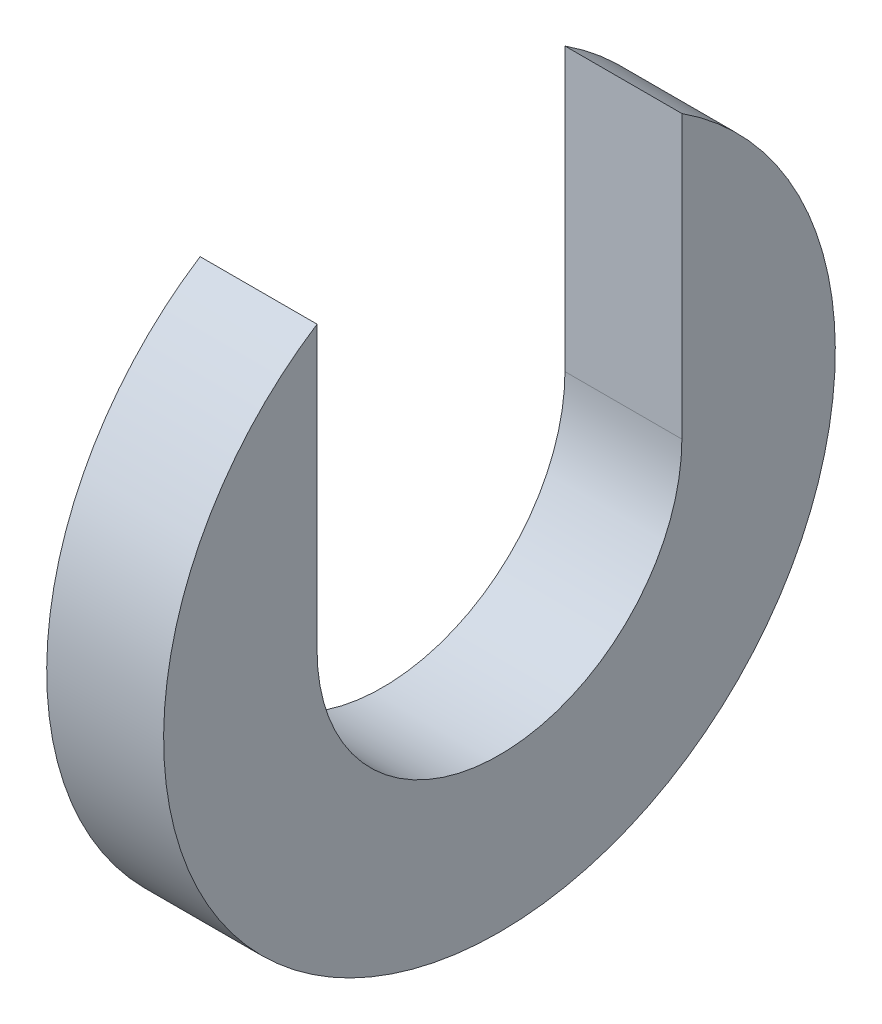
ISO-10303-21;
HEADER;
FILE_DESCRIPTION(('STEP AP214'),'2;1');
FILE_NAME('part.step','',(''),(''),'','','');
FILE_SCHEMA(('AUTOMOTIVE_DESIGN { 1 0 10303 214 1 1 1 1 }'));
ENDSEC;
DATA;
#1=APPLICATION_CONTEXT('core data for automotive mechanical design processes');
#2=APPLICATION_PROTOCOL_DEFINITION('international standard','automotive_design',2000,#1);
#3=PRODUCT_CONTEXT('',#1,'mechanical');
#4=PRODUCT('Part','Part','',(#3));
#5=PRODUCT_RELATED_PRODUCT_CATEGORY('part','',(#4));
#6=PRODUCT_DEFINITION_FORMATION('','',#4);
#7=PRODUCT_DEFINITION_CONTEXT('part definition',#1,'design');
#8=PRODUCT_DEFINITION('design','',#6,#7);
#9=PRODUCT_DEFINITION_SHAPE('','',#8);
#10=(LENGTH_UNIT() NAMED_UNIT(*) SI_UNIT(.MILLI.,.METRE.));
#11=(NAMED_UNIT(*) PLANE_ANGLE_UNIT() SI_UNIT($,.RADIAN.));
#12=(NAMED_UNIT(*) SI_UNIT($,.STERADIAN.) SOLID_ANGLE_UNIT());
#13=UNCERTAINTY_MEASURE_WITH_UNIT(LENGTH_MEASURE(1.E-05),#10,'distance_accuracy_value','');
#14=(GEOMETRIC_REPRESENTATION_CONTEXT(3) GLOBAL_UNCERTAINTY_ASSIGNED_CONTEXT((#13)) GLOBAL_UNIT_ASSIGNED_CONTEXT((#10,
#11,#12)) REPRESENTATION_CONTEXT('',''));
#15=CARTESIAN_POINT('',(0.,0.,0.));
#16=DIRECTION('',(0.,0.,1.));
#17=DIRECTION('',(1.,0.,0.));
#18=AXIS2_PLACEMENT_3D('',#15,#16,#17);
#19=CARTESIAN_POINT('',(3.175,0.,0.));
#20=DIRECTION('',(-1.,0.,0.));
#21=DIRECTION('',(0.,0.,1.));
#22=AXIS2_PLACEMENT_3D('',#19,#20,#21);
#23=CYLINDRICAL_SURFACE('',#22,4.953);
#24=CARTESIAN_POINT('',(0.,0.,0.));
#25=DIRECTION('',(-1.,0.,0.));
#26=DIRECTION('',(0.,0.,-1.));
#27=AXIS2_PLACEMENT_3D('',#24,#25,#26);
#28=CIRCLE('',#27,4.953);
#29=CARTESIAN_POINT('',(0.,0.,-4.953));
#30=VERTEX_POINT('',#29);
#31=CARTESIAN_POINT('',(0.,0.,4.953));
#32=VERTEX_POINT('',#31);
#33=EDGE_CURVE('E107',#30,#32,#28,.T.);
#34=ORIENTED_EDGE('',*,*,#33,.T.);
#35=DIRECTION('',(-1.,0.,0.));
#36=VECTOR('',#35,1.);
#37=CARTESIAN_POINT('',(3.175,0.,4.953));
#38=LINE('',#37,#36);
#39=CARTESIAN_POINT('',(3.175,0.,4.953));
#40=VERTEX_POINT('',#39);
#41=EDGE_CURVE('E11',#40,#32,#38,.T.);
#42=ORIENTED_EDGE('',*,*,#41,.F.);
#43=CARTESIAN_POINT('',(3.175,0.,0.));
#44=DIRECTION('',(-1.,0.,0.));
#45=DIRECTION('',(0.,0.,-1.));
#46=AXIS2_PLACEMENT_3D('',#43,#44,#45);
#47=CIRCLE('',#46,4.953);
#48=CARTESIAN_POINT('',(3.175,0.,-4.953));
#49=VERTEX_POINT('',#48);
#50=EDGE_CURVE('E91',#49,#40,#47,.T.);
#51=ORIENTED_EDGE('',*,*,#50,.F.);
#52=DIRECTION('',(-1.,0.,0.));
#53=VECTOR('',#52,1.);
#54=CARTESIAN_POINT('',(3.175,0.,-4.953));
#55=LINE('',#54,#53);
#56=EDGE_CURVE('E103',#49,#30,#55,.T.);
#57=ORIENTED_EDGE('',*,*,#56,.T.);
#58=EDGE_LOOP('',(#34,#42,#51,#57));
#59=FACE_BOUND('',#58,.T.);
#60=ADVANCED_FACE('F39',(#59),#23,.F.);
#61=CARTESIAN_POINT('',(3.175,0.,4.953));
#62=DIRECTION('',(0.,0.,1.));
#63=DIRECTION('',(1.,0.,0.));
#64=AXIS2_PLACEMENT_3D('',#61,#62,#63);
#65=PLANE('',#64);
#66=DIRECTION('',(0.,1.,0.));
#67=VECTOR('',#66,1.);
#68=CARTESIAN_POINT('',(0.,0.,4.953));
#69=LINE('',#68,#67);
#70=CARTESIAN_POINT('',(0.,7.65615157634696,4.953));
#71=VERTEX_POINT('',#70);
#72=EDGE_CURVE('E96',#32,#71,#69,.T.);
#73=ORIENTED_EDGE('',*,*,#72,.T.);
#74=DIRECTION('',(-1.,0.,0.));
#75=VECTOR('',#74,1.);
#76=CARTESIAN_POINT('',(3.175,7.65615157634696,4.953));
#77=LINE('',#76,#75);
#78=CARTESIAN_POINT('',(3.175,7.65615157634696,4.953));
#79=VERTEX_POINT('',#78);
#80=EDGE_CURVE('E48',#79,#71,#77,.T.);
#81=ORIENTED_EDGE('',*,*,#80,.F.);
#82=DIRECTION('',(0.,1.,0.));
#83=VECTOR('',#82,1.);
#84=CARTESIAN_POINT('',(3.175,0.,4.953));
#85=LINE('',#84,#83);
#86=EDGE_CURVE('E86',#40,#79,#85,.T.);
#87=ORIENTED_EDGE('',*,*,#86,.F.);
#88=ORIENTED_EDGE('',*,*,#41,.T.);
#89=EDGE_LOOP('',(#73,#81,#87,#88));
#90=FACE_BOUND('',#89,.T.);
#91=ADVANCED_FACE('F95',(#90),#65,.F.);
#92=CARTESIAN_POINT('',(3.175,0.,0.));
#93=DIRECTION('',(-1.,0.,0.));
#94=DIRECTION('',(0.,0.,1.));
#95=AXIS2_PLACEMENT_3D('',#92,#93,#94);
#96=CYLINDRICAL_SURFACE('',#95,9.1186);
#97=CARTESIAN_POINT('',(0.,0.,0.));
#98=DIRECTION('',(1.,0.,0.));
#99=DIRECTION('',(0.,0.,-1.));
#100=AXIS2_PLACEMENT_3D('',#97,#98,#99);
#101=CIRCLE('',#100,9.1186);
#102=CARTESIAN_POINT('',(0.,7.65615157634696,-4.953));
#103=VERTEX_POINT('',#102);
#104=EDGE_CURVE('E73',#71,#103,#101,.T.);
#105=ORIENTED_EDGE('',*,*,#104,.T.);
#106=DIRECTION('',(-1.,0.,0.));
#107=VECTOR('',#106,1.);
#108=CARTESIAN_POINT('',(3.175,7.65615157634696,-4.953));
#109=LINE('',#108,#107);
#110=CARTESIAN_POINT('',(3.175,7.65615157634696,-4.953));
#111=VERTEX_POINT('',#110);
#112=EDGE_CURVE('E98',#111,#103,#109,.T.);
#113=ORIENTED_EDGE('',*,*,#112,.F.);
#114=CARTESIAN_POINT('',(3.175,0.,0.));
#115=DIRECTION('',(1.,0.,0.));
#116=DIRECTION('',(0.,0.,-1.));
#117=AXIS2_PLACEMENT_3D('',#114,#115,#116);
#118=CIRCLE('',#117,9.1186);
#119=EDGE_CURVE('E89',#79,#111,#118,.T.);
#120=ORIENTED_EDGE('',*,*,#119,.F.);
#121=ORIENTED_EDGE('',*,*,#80,.T.);
#122=EDGE_LOOP('',(#105,#113,#120,#121));
#123=FACE_BOUND('',#122,.T.);
#124=ADVANCED_FACE('F99',(#123),#96,.T.);
#125=CARTESIAN_POINT('',(3.175,0.,-4.953));
#126=DIRECTION('',(0.,0.,-1.));
#127=DIRECTION('',(-1.,0.,0.));
#128=AXIS2_PLACEMENT_3D('',#125,#126,#127);
#129=PLANE('',#128);
#130=DIRECTION('',(0.,-1.,0.));
#131=VECTOR('',#130,1.);
#132=CARTESIAN_POINT('',(0.,0.,-4.953));
#133=LINE('',#132,#131);
#134=EDGE_CURVE('E79',#103,#30,#133,.T.);
#135=ORIENTED_EDGE('',*,*,#134,.T.);
#136=ORIENTED_EDGE('',*,*,#56,.F.);
#137=DIRECTION('',(0.,-1.,0.));
#138=VECTOR('',#137,1.);
#139=CARTESIAN_POINT('',(3.175,0.,-4.953));
#140=LINE('',#139,#138);
#141=EDGE_CURVE('E56',#111,#49,#140,.T.);
#142=ORIENTED_EDGE('',*,*,#141,.F.);
#143=ORIENTED_EDGE('',*,*,#112,.T.);
#144=EDGE_LOOP('',(#135,#136,#142,#143));
#145=FACE_BOUND('',#144,.T.);
#146=ADVANCED_FACE('F120',(#145),#129,.F.);
#147=CARTESIAN_POINT('',(3.175,0.,0.));
#148=DIRECTION('',(1.,0.,0.));
#149=DIRECTION('',(0.,0.,-1.));
#150=AXIS2_PLACEMENT_3D('',#147,#148,#149);
#151=PLANE('',#150);
#152=ORIENTED_EDGE('',*,*,#50,.T.);
#153=ORIENTED_EDGE('',*,*,#86,.T.);
#154=ORIENTED_EDGE('',*,*,#119,.T.);
#155=ORIENTED_EDGE('',*,*,#141,.T.);
#156=EDGE_LOOP('',(#152,#153,#154,#155));
#157=FACE_BOUND('',#156,.T.);
#158=ADVANCED_FACE('F87',(#157),#151,.T.);
#159=CARTESIAN_POINT('',(0.,0.,0.));
#160=DIRECTION('',(1.,0.,0.));
#161=DIRECTION('',(0.,0.,-1.));
#162=AXIS2_PLACEMENT_3D('',#159,#160,#161);
#163=PLANE('',#162);
#164=ORIENTED_EDGE('',*,*,#33,.F.);
#165=ORIENTED_EDGE('',*,*,#134,.F.);
#166=ORIENTED_EDGE('',*,*,#104,.F.);
#167=ORIENTED_EDGE('',*,*,#72,.F.);
#168=EDGE_LOOP('',(#164,#165,#166,#167));
#169=FACE_BOUND('',#168,.T.);
#170=ADVANCED_FACE('F123',(#169),#163,.F.);
#171=CLOSED_SHELL('',(#60,#91,#124,#146,#158,#170));
#172=MANIFOLD_SOLID_BREP('B2',#171);
#173=ADVANCED_BREP_SHAPE_REPRESENTATION('',(#18,#172),#14);
#174=SHAPE_DEFINITION_REPRESENTATION(#9,#173);
ENDSEC;
END-ISO-10303-21;
